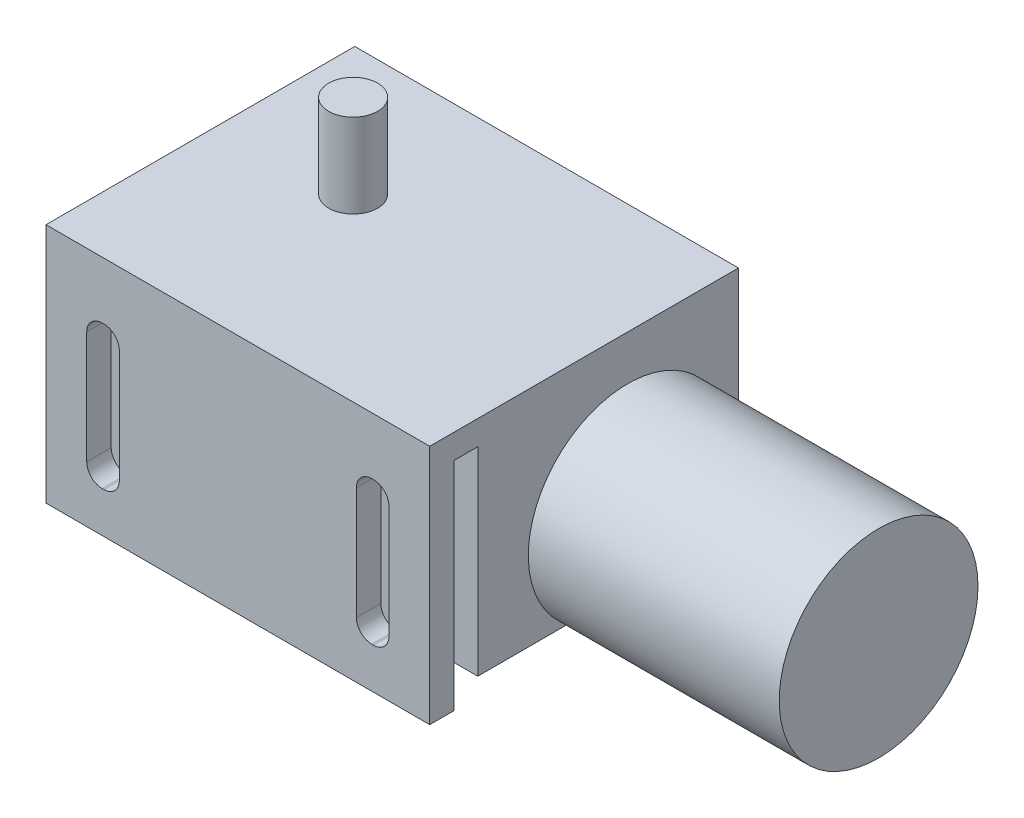
ISO-10303-21;
HEADER;
FILE_DESCRIPTION(('STEP AP214'),'2;1');
FILE_NAME('part.step','',(''),(''),'','','');
FILE_SCHEMA(('AUTOMOTIVE_DESIGN { 1 0 10303 214 1 1 1 1 }'));
ENDSEC;
DATA;
#1=APPLICATION_CONTEXT('core data for automotive mechanical design processes');
#2=APPLICATION_PROTOCOL_DEFINITION('international standard','automotive_design',2000,#1);
#3=PRODUCT_CONTEXT('',#1,'mechanical');
#4=PRODUCT('Part','Part','',(#3));
#5=PRODUCT_RELATED_PRODUCT_CATEGORY('part','',(#4));
#6=PRODUCT_DEFINITION_FORMATION('','',#4);
#7=PRODUCT_DEFINITION_CONTEXT('part definition',#1,'design');
#8=PRODUCT_DEFINITION('design','',#6,#7);
#9=PRODUCT_DEFINITION_SHAPE('','',#8);
#10=(LENGTH_UNIT() NAMED_UNIT(*) SI_UNIT(.MILLI.,.METRE.));
#11=(NAMED_UNIT(*) PLANE_ANGLE_UNIT() SI_UNIT($,.RADIAN.));
#12=(NAMED_UNIT(*) SI_UNIT($,.STERADIAN.) SOLID_ANGLE_UNIT());
#13=UNCERTAINTY_MEASURE_WITH_UNIT(LENGTH_MEASURE(1.E-05),#10,'distance_accuracy_value','');
#14=(GEOMETRIC_REPRESENTATION_CONTEXT(3) GLOBAL_UNCERTAINTY_ASSIGNED_CONTEXT((#13)) GLOBAL_UNIT_ASSIGNED_CONTEXT((#10,
#11,#12)) REPRESENTATION_CONTEXT('',''));
#15=CARTESIAN_POINT('',(0.,0.,0.));
#16=DIRECTION('',(0.,0.,1.));
#17=DIRECTION('',(1.,0.,0.));
#18=AXIS2_PLACEMENT_3D('',#15,#16,#17);
#19=CARTESIAN_POINT('',(0.,0.,37.9));
#20=DIRECTION('',(0.,0.,1.));
#21=DIRECTION('',(1.,0.,0.));
#22=AXIS2_PLACEMENT_3D('',#19,#20,#21);
#23=PLANE('',#22);
#24=DIRECTION('',(0.,1.,0.));
#25=VECTOR('',#24,1.);
#26=CARTESIAN_POINT('',(23.55,14.8,37.9));
#27=LINE('',#26,#25);
#28=CARTESIAN_POINT('',(23.55,-14.8,37.9));
#29=VERTEX_POINT('',#28);
#30=CARTESIAN_POINT('',(23.55,14.8,37.9));
#31=VERTEX_POINT('',#30);
#32=EDGE_CURVE('E378',#29,#31,#27,.T.);
#33=ORIENTED_EDGE('',*,*,#32,.T.);
#34=DIRECTION('',(-1.,0.,0.));
#35=VECTOR('',#34,1.);
#36=CARTESIAN_POINT('',(-23.55,14.8,37.9));
#37=LINE('',#36,#35);
#38=CARTESIAN_POINT('',(-23.55,14.8,37.9));
#39=VERTEX_POINT('',#38);
#40=EDGE_CURVE('E381',#31,#39,#37,.T.);
#41=ORIENTED_EDGE('',*,*,#40,.T.);
#42=DIRECTION('',(0.,-1.,0.));
#43=VECTOR('',#42,1.);
#44=CARTESIAN_POINT('',(-23.55,14.8,37.9));
#45=LINE('',#44,#43);
#46=CARTESIAN_POINT('',(-23.55,-14.8,37.9));
#47=VERTEX_POINT('',#46);
#48=EDGE_CURVE('E384',#39,#47,#45,.T.);
#49=ORIENTED_EDGE('',*,*,#48,.T.);
#50=DIRECTION('',(1.,0.,0.));
#51=VECTOR('',#50,1.);
#52=CARTESIAN_POINT('',(-23.55,-14.8,37.9));
#53=LINE('',#52,#51);
#54=EDGE_CURVE('E386',#47,#29,#53,.T.);
#55=ORIENTED_EDGE('',*,*,#54,.T.);
#56=EDGE_LOOP('',(#33,#41,#49,#55));
#57=FACE_BOUND('',#56,.T.);
#58=DIRECTION('',(0.,-1.,0.));
#59=VECTOR('',#58,1.);
#60=CARTESIAN_POINT('',(-18.55,0.,37.9));
#61=LINE('',#60,#59);
#62=CARTESIAN_POINT('',(-18.55,5.89999999999999,37.9));
#63=VERTEX_POINT('',#62);
#64=CARTESIAN_POINT('',(-18.55,-7.89999999999999,37.9));
#65=VERTEX_POINT('',#64);
#66=EDGE_CURVE('E315',#63,#65,#61,.T.);
#67=ORIENTED_EDGE('',*,*,#66,.F.);
#68=CARTESIAN_POINT('',(-16.65,5.9,37.9));
#69=DIRECTION('',(0.,0.,1.));
#70=DIRECTION('',(1.,0.,0.));
#71=AXIS2_PLACEMENT_3D('',#68,#69,#70);
#72=CIRCLE('',#71,1.9);
#73=CARTESIAN_POINT('',(-16.65,7.8,37.9));
#74=VERTEX_POINT('',#73);
#75=EDGE_CURVE('E251',#63,#74,#72,.F.);
#76=ORIENTED_EDGE('',*,*,#75,.T.);
#77=DIRECTION('',(-1.,0.,0.));
#78=VECTOR('',#77,1.);
#79=CARTESIAN_POINT('',(0.,7.8,37.9));
#80=LINE('',#79,#78);
#81=CARTESIAN_POINT('',(-16.45,7.8,37.9));
#82=VERTEX_POINT('',#81);
#83=EDGE_CURVE('E333',#82,#74,#80,.T.);
#84=ORIENTED_EDGE('',*,*,#83,.F.);
#85=CARTESIAN_POINT('',(-16.45,5.9,37.9));
#86=DIRECTION('',(0.,0.,1.));
#87=DIRECTION('',(1.,0.,0.));
#88=AXIS2_PLACEMENT_3D('',#85,#86,#87);
#89=CIRCLE('',#88,1.9);
#90=CARTESIAN_POINT('',(-14.55,5.89999999999999,37.9));
#91=VERTEX_POINT('',#90);
#92=EDGE_CURVE('E330',#82,#91,#89,.F.);
#93=ORIENTED_EDGE('',*,*,#92,.T.);
#94=DIRECTION('',(0.,-1.,0.));
#95=VECTOR('',#94,1.);
#96=CARTESIAN_POINT('',(-14.55,0.,37.9));
#97=LINE('',#96,#95);
#98=CARTESIAN_POINT('',(-14.55,-7.89999999999999,37.9));
#99=VERTEX_POINT('',#98);
#100=EDGE_CURVE('E327',#91,#99,#97,.T.);
#101=ORIENTED_EDGE('',*,*,#100,.T.);
#102=CARTESIAN_POINT('',(-16.45,-7.9,37.9));
#103=DIRECTION('',(0.,0.,1.));
#104=DIRECTION('',(1.,0.,0.));
#105=AXIS2_PLACEMENT_3D('',#102,#103,#104);
#106=CIRCLE('',#105,1.9);
#107=CARTESIAN_POINT('',(-16.45,-9.8,37.9));
#108=VERTEX_POINT('',#107);
#109=EDGE_CURVE('E324',#99,#108,#106,.F.);
#110=ORIENTED_EDGE('',*,*,#109,.T.);
#111=DIRECTION('',(-1.,0.,0.));
#112=VECTOR('',#111,1.);
#113=CARTESIAN_POINT('',(0.,-9.8,37.9));
#114=LINE('',#113,#112);
#115=CARTESIAN_POINT('',(-16.65,-9.8,37.9));
#116=VERTEX_POINT('',#115);
#117=EDGE_CURVE('E321',#108,#116,#114,.T.);
#118=ORIENTED_EDGE('',*,*,#117,.T.);
#119=CARTESIAN_POINT('',(-16.65,-7.9,37.9));
#120=DIRECTION('',(0.,0.,1.));
#121=DIRECTION('',(1.,0.,0.));
#122=AXIS2_PLACEMENT_3D('',#119,#120,#121);
#123=CIRCLE('',#122,1.9);
#124=EDGE_CURVE('E318',#116,#65,#123,.F.);
#125=ORIENTED_EDGE('',*,*,#124,.T.);
#126=EDGE_LOOP('',(#67,#76,#84,#93,#101,#110,#118,#125));
#127=FACE_BOUND('',#126,.T.);
#128=CARTESIAN_POINT('',(16.45,5.9,37.9));
#129=DIRECTION('',(0.,0.,-1.));
#130=DIRECTION('',(-1.,0.,0.));
#131=AXIS2_PLACEMENT_3D('',#128,#129,#130);
#132=CIRCLE('',#131,1.9);
#133=CARTESIAN_POINT('',(16.45,7.8,37.9));
#134=VERTEX_POINT('',#133);
#135=CARTESIAN_POINT('',(14.55,5.89999999999999,37.9));
#136=VERTEX_POINT('',#135);
#137=EDGE_CURVE('E257',#134,#136,#132,.F.);
#138=ORIENTED_EDGE('',*,*,#137,.F.);
#139=DIRECTION('',(1.,0.,0.));
#140=VECTOR('',#139,1.);
#141=CARTESIAN_POINT('',(0.,7.8,37.9));
#142=LINE('',#141,#140);
#143=CARTESIAN_POINT('',(16.65,7.8,37.9));
#144=VERTEX_POINT('',#143);
#145=EDGE_CURVE('E254',#134,#144,#142,.T.);
#146=ORIENTED_EDGE('',*,*,#145,.T.);
#147=CARTESIAN_POINT('',(16.65,5.9,37.9));
#148=DIRECTION('',(0.,0.,-1.));
#149=DIRECTION('',(-1.,0.,0.));
#150=AXIS2_PLACEMENT_3D('',#147,#148,#149);
#151=CIRCLE('',#150,1.9);
#152=CARTESIAN_POINT('',(18.55,5.9,37.9));
#153=VERTEX_POINT('',#152);
#154=EDGE_CURVE('E234',#153,#144,#151,.F.);
#155=ORIENTED_EDGE('',*,*,#154,.F.);
#156=DIRECTION('',(0.,-1.,0.));
#157=VECTOR('',#156,1.);
#158=CARTESIAN_POINT('',(18.55,0.,37.9));
#159=LINE('',#158,#157);
#160=CARTESIAN_POINT('',(18.55,-7.89999999999999,37.9));
#161=VERTEX_POINT('',#160);
#162=EDGE_CURVE('E64',#153,#161,#159,.T.);
#163=ORIENTED_EDGE('',*,*,#162,.T.);
#164=CARTESIAN_POINT('',(16.65,-7.9,37.9));
#165=DIRECTION('',(0.,0.,-1.));
#166=DIRECTION('',(-1.,0.,0.));
#167=AXIS2_PLACEMENT_3D('',#164,#165,#166);
#168=CIRCLE('',#167,1.9);
#169=CARTESIAN_POINT('',(16.65,-9.8,37.9));
#170=VERTEX_POINT('',#169);
#171=EDGE_CURVE('E269',#170,#161,#168,.F.);
#172=ORIENTED_EDGE('',*,*,#171,.F.);
#173=DIRECTION('',(1.,0.,0.));
#174=VECTOR('',#173,1.);
#175=CARTESIAN_POINT('',(0.,-9.8,37.9));
#176=LINE('',#175,#174);
#177=CARTESIAN_POINT('',(16.45,-9.8,37.9));
#178=VERTEX_POINT('',#177);
#179=EDGE_CURVE('E266',#178,#170,#176,.T.);
#180=ORIENTED_EDGE('',*,*,#179,.F.);
#181=CARTESIAN_POINT('',(16.45,-7.9,37.9));
#182=DIRECTION('',(0.,0.,-1.));
#183=DIRECTION('',(-1.,0.,0.));
#184=AXIS2_PLACEMENT_3D('',#181,#182,#183);
#185=CIRCLE('',#184,1.9);
#186=CARTESIAN_POINT('',(14.55,-7.89999999999999,37.9));
#187=VERTEX_POINT('',#186);
#188=EDGE_CURVE('E263',#187,#178,#185,.F.);
#189=ORIENTED_EDGE('',*,*,#188,.F.);
#190=DIRECTION('',(0.,-1.,0.));
#191=VECTOR('',#190,1.);
#192=CARTESIAN_POINT('',(14.55,0.,37.9));
#193=LINE('',#192,#191);
#194=EDGE_CURVE('E260',#136,#187,#193,.T.);
#195=ORIENTED_EDGE('',*,*,#194,.F.);
#196=EDGE_LOOP('',(#138,#146,#155,#163,#172,#180,#189,#195));
#197=FACE_BOUND('',#196,.T.);
#198=ADVANCED_FACE('F41',(#57,#127,#197),#23,.T.);
#199=CARTESIAN_POINT('',(-23.55,61.9891936782141,34.9));
#200=DIRECTION('',(0.,0.,1.));
#201=DIRECTION('',(1.,0.,0.));
#202=AXIS2_PLACEMENT_3D('',#199,#200,#201);
#203=PLANE('',#202);
#204=CARTESIAN_POINT('',(-16.65,5.9,34.9));
#205=DIRECTION('',(0.,0.,1.));
#206=DIRECTION('',(1.,0.,0.));
#207=AXIS2_PLACEMENT_3D('',#204,#205,#206);
#208=CIRCLE('',#207,1.9);
#209=CARTESIAN_POINT('',(-16.65,7.8,34.9));
#210=VERTEX_POINT('',#209);
#211=CARTESIAN_POINT('',(-18.55,5.89999999999999,34.9));
#212=VERTEX_POINT('',#211);
#213=EDGE_CURVE('E309',#210,#212,#208,.T.);
#214=ORIENTED_EDGE('',*,*,#213,.T.);
#215=DIRECTION('',(0.,1.,0.));
#216=VECTOR('',#215,1.);
#217=CARTESIAN_POINT('',(-18.55,0.,34.9));
#218=LINE('',#217,#216);
#219=CARTESIAN_POINT('',(-18.55,-7.89999999999998,34.9));
#220=VERTEX_POINT('',#219);
#221=EDGE_CURVE('E312',#220,#212,#218,.T.);
#222=ORIENTED_EDGE('',*,*,#221,.F.);
#223=CARTESIAN_POINT('',(-16.65,-7.9,34.9));
#224=DIRECTION('',(0.,0.,1.));
#225=DIRECTION('',(1.,0.,0.));
#226=AXIS2_PLACEMENT_3D('',#223,#224,#225);
#227=CIRCLE('',#226,1.9);
#228=CARTESIAN_POINT('',(-16.65,-9.8,34.9));
#229=VERTEX_POINT('',#228);
#230=EDGE_CURVE('E291',#220,#229,#227,.T.);
#231=ORIENTED_EDGE('',*,*,#230,.T.);
#232=DIRECTION('',(1.,0.,0.));
#233=VECTOR('',#232,1.);
#234=CARTESIAN_POINT('',(0.,-9.8,34.9));
#235=LINE('',#234,#233);
#236=CARTESIAN_POINT('',(-16.45,-9.8,34.9));
#237=VERTEX_POINT('',#236);
#238=EDGE_CURVE('E294',#229,#237,#235,.T.);
#239=ORIENTED_EDGE('',*,*,#238,.T.);
#240=CARTESIAN_POINT('',(-16.45,-7.9,34.9));
#241=DIRECTION('',(0.,0.,1.));
#242=DIRECTION('',(1.,0.,0.));
#243=AXIS2_PLACEMENT_3D('',#240,#241,#242);
#244=CIRCLE('',#243,1.9);
#245=CARTESIAN_POINT('',(-14.55,-7.9,34.9));
#246=VERTEX_POINT('',#245);
#247=EDGE_CURVE('E298',#237,#246,#244,.T.);
#248=ORIENTED_EDGE('',*,*,#247,.T.);
#249=DIRECTION('',(0.,1.,0.));
#250=VECTOR('',#249,1.);
#251=CARTESIAN_POINT('',(-14.55,0.,34.9));
#252=LINE('',#251,#250);
#253=CARTESIAN_POINT('',(-14.55,5.89999999999999,34.9));
#254=VERTEX_POINT('',#253);
#255=EDGE_CURVE('E301',#246,#254,#252,.T.);
#256=ORIENTED_EDGE('',*,*,#255,.T.);
#257=CARTESIAN_POINT('',(-16.45,5.9,34.9));
#258=DIRECTION('',(0.,0.,1.));
#259=DIRECTION('',(1.,0.,0.));
#260=AXIS2_PLACEMENT_3D('',#257,#258,#259);
#261=CIRCLE('',#260,1.9);
#262=CARTESIAN_POINT('',(-16.45,7.8,34.9));
#263=VERTEX_POINT('',#262);
#264=EDGE_CURVE('E304',#254,#263,#261,.T.);
#265=ORIENTED_EDGE('',*,*,#264,.T.);
#266=DIRECTION('',(1.,0.,0.));
#267=VECTOR('',#266,1.);
#268=CARTESIAN_POINT('',(0.,7.8,34.9));
#269=LINE('',#268,#267);
#270=EDGE_CURVE('E307',#210,#263,#269,.T.);
#271=ORIENTED_EDGE('',*,*,#270,.F.);
#272=EDGE_LOOP('',(#214,#222,#231,#239,#248,#256,#265,#271));
#273=FACE_BOUND('',#272,.T.);
#274=DIRECTION('',(1.,0.,0.));
#275=VECTOR('',#274,1.);
#276=CARTESIAN_POINT('',(-23.55,11.8,34.9));
#277=LINE('',#276,#275);
#278=CARTESIAN_POINT('',(-23.55,11.8,34.9));
#279=VERTEX_POINT('',#278);
#280=CARTESIAN_POINT('',(23.55,11.8,34.9));
#281=VERTEX_POINT('',#280);
#282=EDGE_CURVE('E356',#279,#281,#277,.T.);
#283=ORIENTED_EDGE('',*,*,#282,.T.);
#284=DIRECTION('',(0.,-1.,0.));
#285=VECTOR('',#284,1.);
#286=CARTESIAN_POINT('',(23.55,61.9891936782141,34.9));
#287=LINE('',#286,#285);
#288=CARTESIAN_POINT('',(23.55,-14.8,34.9));
#289=VERTEX_POINT('',#288);
#290=EDGE_CURVE('E367',#281,#289,#287,.T.);
#291=ORIENTED_EDGE('',*,*,#290,.T.);
#292=DIRECTION('',(-1.,0.,0.));
#293=VECTOR('',#292,1.);
#294=CARTESIAN_POINT('',(-23.55,-14.8,34.9));
#295=LINE('',#294,#293);
#296=CARTESIAN_POINT('',(-23.55,-14.8,34.9));
#297=VERTEX_POINT('',#296);
#298=EDGE_CURVE('E353',#289,#297,#295,.T.);
#299=ORIENTED_EDGE('',*,*,#298,.T.);
#300=DIRECTION('',(0.,-1.,0.));
#301=VECTOR('',#300,1.);
#302=CARTESIAN_POINT('',(-23.55,61.9891936782141,34.9));
#303=LINE('',#302,#301);
#304=EDGE_CURVE('E357',#279,#297,#303,.T.);
#305=ORIENTED_EDGE('',*,*,#304,.F.);
#306=EDGE_LOOP('',(#283,#291,#299,#305));
#307=FACE_BOUND('',#306,.T.);
#308=DIRECTION('',(-1.,0.,0.));
#309=VECTOR('',#308,1.);
#310=CARTESIAN_POINT('',(0.,7.8,34.9));
#311=LINE('',#310,#309);
#312=CARTESIAN_POINT('',(16.65,7.8,34.9));
#313=VERTEX_POINT('',#312);
#314=CARTESIAN_POINT('',(16.45,7.8,34.9));
#315=VERTEX_POINT('',#314);
#316=EDGE_CURVE('E238',#313,#315,#311,.T.);
#317=ORIENTED_EDGE('',*,*,#316,.T.);
#318=CARTESIAN_POINT('',(16.45,5.9,34.9));
#319=DIRECTION('',(0.,0.,1.));
#320=DIRECTION('',(1.,0.,0.));
#321=AXIS2_PLACEMENT_3D('',#318,#319,#320);
#322=CIRCLE('',#321,1.9);
#323=CARTESIAN_POINT('',(14.55,5.89999999999999,34.9));
#324=VERTEX_POINT('',#323);
#325=EDGE_CURVE('E235',#324,#315,#322,.F.);
#326=ORIENTED_EDGE('',*,*,#325,.F.);
#327=DIRECTION('',(0.,1.,0.));
#328=VECTOR('',#327,1.);
#329=CARTESIAN_POINT('',(14.55,0.,34.9));
#330=LINE('',#329,#328);
#331=CARTESIAN_POINT('',(14.55,-7.89999999999999,34.9));
#332=VERTEX_POINT('',#331);
#333=EDGE_CURVE('E237',#332,#324,#330,.T.);
#334=ORIENTED_EDGE('',*,*,#333,.F.);
#335=CARTESIAN_POINT('',(16.45,-7.9,34.9));
#336=DIRECTION('',(0.,0.,1.));
#337=DIRECTION('',(1.,0.,0.));
#338=AXIS2_PLACEMENT_3D('',#335,#336,#337);
#339=CIRCLE('',#338,1.9);
#340=CARTESIAN_POINT('',(16.45,-9.8,34.9));
#341=VERTEX_POINT('',#340);
#342=EDGE_CURVE('E240',#341,#332,#339,.F.);
#343=ORIENTED_EDGE('',*,*,#342,.F.);
#344=DIRECTION('',(-1.,0.,0.));
#345=VECTOR('',#344,1.);
#346=CARTESIAN_POINT('',(0.,-9.8,34.9));
#347=LINE('',#346,#345);
#348=CARTESIAN_POINT('',(16.65,-9.8,34.9));
#349=VERTEX_POINT('',#348);
#350=EDGE_CURVE('E242',#349,#341,#347,.T.);
#351=ORIENTED_EDGE('',*,*,#350,.F.);
#352=CARTESIAN_POINT('',(16.65,-7.9,34.9));
#353=DIRECTION('',(0.,0.,1.));
#354=DIRECTION('',(1.,0.,0.));
#355=AXIS2_PLACEMENT_3D('',#352,#353,#354);
#356=CIRCLE('',#355,1.9);
#357=CARTESIAN_POINT('',(18.55,-7.9,34.9));
#358=VERTEX_POINT('',#357);
#359=EDGE_CURVE('E244',#358,#349,#356,.F.);
#360=ORIENTED_EDGE('',*,*,#359,.F.);
#361=DIRECTION('',(0.,1.,0.));
#362=VECTOR('',#361,1.);
#363=CARTESIAN_POINT('',(18.55,0.,34.9));
#364=LINE('',#363,#362);
#365=CARTESIAN_POINT('',(18.55,5.89999999999999,34.9));
#366=VERTEX_POINT('',#365);
#367=EDGE_CURVE('E246',#358,#366,#364,.T.);
#368=ORIENTED_EDGE('',*,*,#367,.T.);
#369=CARTESIAN_POINT('',(16.65,5.9,34.9));
#370=DIRECTION('',(0.,0.,1.));
#371=DIRECTION('',(1.,0.,0.));
#372=AXIS2_PLACEMENT_3D('',#369,#370,#371);
#373=CIRCLE('',#372,1.9);
#374=EDGE_CURVE('E249',#313,#366,#373,.F.);
#375=ORIENTED_EDGE('',*,*,#374,.F.);
#376=EDGE_LOOP('',(#317,#326,#334,#343,#351,#360,#368,#375));
#377=FACE_BOUND('',#376,.T.);
#378=ADVANCED_FACE('F435',(#273,#307,#377),#203,.F.);
#379=CARTESIAN_POINT('',(23.55,14.8,37.9));
#380=DIRECTION('',(-1.,0.,0.));
#381=DIRECTION('',(0.,0.,1.));
#382=AXIS2_PLACEMENT_3D('',#379,#380,#381);
#383=PLANE('',#382);
#384=CARTESIAN_POINT('',(23.55,-2.9,13.6));
#385=DIRECTION('',(1.,0.,0.));
#386=DIRECTION('',(0.,0.,-1.));
#387=AXIS2_PLACEMENT_3D('',#384,#385,#386);
#388=CIRCLE('',#387,12.2);
#389=CARTESIAN_POINT('',(23.55,-12.6,6.20067570652563));
#390=VERTEX_POINT('',#389);
#391=CARTESIAN_POINT('',(23.55,-12.6,20.9993242934744));
#392=VERTEX_POINT('',#391);
#393=EDGE_CURVE('E12',#390,#392,#388,.T.);
#394=ORIENTED_EDGE('',*,*,#393,.F.);
#395=DIRECTION('',(0.,0.,1.));
#396=VECTOR('',#395,1.);
#397=CARTESIAN_POINT('',(23.55,-12.6,0.));
#398=LINE('',#397,#396);
#399=CARTESIAN_POINT('',(23.55,-12.6,0.));
#400=VERTEX_POINT('',#399);
#401=EDGE_CURVE('E215',#400,#390,#398,.T.);
#402=ORIENTED_EDGE('',*,*,#401,.F.);
#403=DIRECTION('',(0.,1.,0.));
#404=VECTOR('',#403,1.);
#405=CARTESIAN_POINT('',(23.55,14.8,0.));
#406=LINE('',#405,#404);
#407=CARTESIAN_POINT('',(23.55,14.8,0.));
#408=VERTEX_POINT('',#407);
#409=EDGE_CURVE('E377',#400,#408,#406,.T.);
#410=ORIENTED_EDGE('',*,*,#409,.T.);
#411=DIRECTION('',(0.,0.,-1.));
#412=VECTOR('',#411,1.);
#413=CARTESIAN_POINT('',(23.55,14.8,37.9));
#414=LINE('',#413,#412);
#415=EDGE_CURVE('E401',#31,#408,#414,.T.);
#416=ORIENTED_EDGE('',*,*,#415,.F.);
#417=ORIENTED_EDGE('',*,*,#32,.F.);
#418=DIRECTION('',(0.,0.,-1.));
#419=VECTOR('',#418,1.);
#420=CARTESIAN_POINT('',(23.55,-14.8,37.9));
#421=LINE('',#420,#419);
#422=EDGE_CURVE('E388',#29,#289,#421,.T.);
#423=ORIENTED_EDGE('',*,*,#422,.T.);
#424=ORIENTED_EDGE('',*,*,#290,.F.);
#425=DIRECTION('',(0.,0.,-1.));
#426=VECTOR('',#425,1.);
#427=CARTESIAN_POINT('',(23.55,11.8,32.));
#428=LINE('',#427,#426);
#429=CARTESIAN_POINT('',(23.55,11.8,32.));
#430=VERTEX_POINT('',#429);
#431=EDGE_CURVE('E354',#281,#430,#428,.T.);
#432=ORIENTED_EDGE('',*,*,#431,.T.);
#433=DIRECTION('',(0.,-1.,0.));
#434=VECTOR('',#433,1.);
#435=CARTESIAN_POINT('',(23.55,61.9891936782141,32.));
#436=LINE('',#435,#434);
#437=CARTESIAN_POINT('',(23.55,-12.6,32.));
#438=VERTEX_POINT('',#437);
#439=EDGE_CURVE('E222',#430,#438,#436,.T.);
#440=ORIENTED_EDGE('',*,*,#439,.T.);
#441=EDGE_CURVE('E213',#392,#438,#398,.T.);
#442=ORIENTED_EDGE('',*,*,#441,.F.);
#443=EDGE_LOOP('',(#394,#402,#410,#416,#417,#423,#424,#432,#440,#442));
#444=FACE_BOUND('',#443,.T.);
#445=ADVANCED_FACE('F43',(#444),#383,.F.);
#446=CARTESIAN_POINT('',(-23.55,14.8,37.9));
#447=DIRECTION('',(0.,-1.,0.));
#448=DIRECTION('',(0.,0.,-1.));
#449=AXIS2_PLACEMENT_3D('',#446,#447,#448);
#450=PLANE('',#449);
#451=CARTESIAN_POINT('',(-7.95,14.8,15.8));
#452=DIRECTION('',(0.,-1.,0.));
#453=DIRECTION('',(0.,0.,-1.));
#454=AXIS2_PLACEMENT_3D('',#451,#452,#453);
#455=CIRCLE('',#454,3.);
#456=CARTESIAN_POINT('',(-7.95,14.8,12.8));
#457=VERTEX_POINT('',#456);
#458=EDGE_CURVE('E45',#457,#457,#455,.F.);
#459=ORIENTED_EDGE('',*,*,#458,.F.);
#460=EDGE_LOOP('',(#459));
#461=FACE_BOUND('',#460,.T.);
#462=DIRECTION('',(-1.,0.,0.));
#463=VECTOR('',#462,1.);
#464=CARTESIAN_POINT('',(-23.55,14.8,0.));
#465=LINE('',#464,#463);
#466=CARTESIAN_POINT('',(-23.55,14.8,0.));
#467=VERTEX_POINT('',#466);
#468=EDGE_CURVE('E390',#408,#467,#465,.T.);
#469=ORIENTED_EDGE('',*,*,#468,.T.);
#470=DIRECTION('',(0.,0.,-1.));
#471=VECTOR('',#470,1.);
#472=CARTESIAN_POINT('',(-23.55,14.8,37.9));
#473=LINE('',#472,#471);
#474=EDGE_CURVE('E399',#39,#467,#473,.T.);
#475=ORIENTED_EDGE('',*,*,#474,.F.);
#476=ORIENTED_EDGE('',*,*,#40,.F.);
#477=ORIENTED_EDGE('',*,*,#415,.T.);
#478=EDGE_LOOP('',(#469,#475,#476,#477));
#479=FACE_BOUND('',#478,.T.);
#480=ADVANCED_FACE('F410',(#461,#479),#450,.F.);
#481=CARTESIAN_POINT('',(-23.55,14.8,37.9));
#482=DIRECTION('',(1.,0.,0.));
#483=DIRECTION('',(0.,0.,-1.));
#484=AXIS2_PLACEMENT_3D('',#481,#482,#483);
#485=PLANE('',#484);
#486=DIRECTION('',(0.,0.,1.));
#487=VECTOR('',#486,1.);
#488=CARTESIAN_POINT('',(-23.55,11.8,32.));
#489=LINE('',#488,#487);
#490=CARTESIAN_POINT('',(-23.55,11.8,32.));
#491=VERTEX_POINT('',#490);
#492=EDGE_CURVE('E359',#491,#279,#489,.T.);
#493=ORIENTED_EDGE('',*,*,#492,.T.);
#494=ORIENTED_EDGE('',*,*,#304,.T.);
#495=DIRECTION('',(0.,0.,-1.));
#496=VECTOR('',#495,1.);
#497=CARTESIAN_POINT('',(-23.55,-14.8,37.9));
#498=LINE('',#497,#496);
#499=EDGE_CURVE('E396',#47,#297,#498,.T.);
#500=ORIENTED_EDGE('',*,*,#499,.F.);
#501=ORIENTED_EDGE('',*,*,#48,.F.);
#502=ORIENTED_EDGE('',*,*,#474,.T.);
#503=DIRECTION('',(0.,-1.,0.));
#504=VECTOR('',#503,1.);
#505=CARTESIAN_POINT('',(-23.55,14.8,0.));
#506=LINE('',#505,#504);
#507=CARTESIAN_POINT('',(-23.55,-12.6,0.));
#508=VERTEX_POINT('',#507);
#509=EDGE_CURVE('E382',#467,#508,#506,.T.);
#510=ORIENTED_EDGE('',*,*,#509,.T.);
#511=DIRECTION('',(0.,0.,-1.));
#512=VECTOR('',#511,1.);
#513=CARTESIAN_POINT('',(-23.55,-12.6,0.));
#514=LINE('',#513,#512);
#515=CARTESIAN_POINT('',(-23.55,-12.6,32.));
#516=VERTEX_POINT('',#515);
#517=EDGE_CURVE('E372',#516,#508,#514,.T.);
#518=ORIENTED_EDGE('',*,*,#517,.F.);
#519=DIRECTION('',(0.,-1.,0.));
#520=VECTOR('',#519,1.);
#521=CARTESIAN_POINT('',(-23.55,61.9891936782141,32.));
#522=LINE('',#521,#520);
#523=EDGE_CURVE('E364',#491,#516,#522,.T.);
#524=ORIENTED_EDGE('',*,*,#523,.F.);
#525=EDGE_LOOP('',(#493,#494,#500,#501,#502,#510,#518,#524));
#526=FACE_BOUND('',#525,.T.);
#527=ADVANCED_FACE('F412',(#526),#485,.F.);
#528=CARTESIAN_POINT('',(-23.55,-14.8,37.9));
#529=DIRECTION('',(0.,1.,0.));
#530=DIRECTION('',(0.,0.,1.));
#531=AXIS2_PLACEMENT_3D('',#528,#529,#530);
#532=PLANE('',#531);
#533=ORIENTED_EDGE('',*,*,#499,.T.);
#534=ORIENTED_EDGE('',*,*,#298,.F.);
#535=ORIENTED_EDGE('',*,*,#422,.F.);
#536=ORIENTED_EDGE('',*,*,#54,.F.);
#537=EDGE_LOOP('',(#533,#534,#535,#536));
#538=FACE_BOUND('',#537,.T.);
#539=ADVANCED_FACE('F432',(#538),#532,.F.);
#540=CARTESIAN_POINT('',(0.,0.,0.));
#541=DIRECTION('',(0.,0.,1.));
#542=DIRECTION('',(1.,0.,0.));
#543=AXIS2_PLACEMENT_3D('',#540,#541,#542);
#544=PLANE('',#543);
#545=ORIENTED_EDGE('',*,*,#409,.F.);
#546=DIRECTION('',(1.,0.,0.));
#547=VECTOR('',#546,1.);
#548=CARTESIAN_POINT('',(-23.55,-12.6,0.));
#549=LINE('',#548,#547);
#550=EDGE_CURVE('E223',#508,#400,#549,.T.);
#551=ORIENTED_EDGE('',*,*,#550,.F.);
#552=ORIENTED_EDGE('',*,*,#509,.F.);
#553=ORIENTED_EDGE('',*,*,#468,.F.);
#554=EDGE_LOOP('',(#545,#551,#552,#553));
#555=FACE_BOUND('',#554,.T.);
#556=ADVANCED_FACE('F423',(#555),#544,.F.);
#557=CARTESIAN_POINT('',(0.,-12.6,0.));
#558=DIRECTION('',(0.,1.,0.));
#559=DIRECTION('',(0.,0.,1.));
#560=AXIS2_PLACEMENT_3D('',#557,#558,#559);
#561=PLANE('',#560);
#562=ORIENTED_EDGE('',*,*,#517,.T.);
#563=ORIENTED_EDGE('',*,*,#550,.T.);
#564=ORIENTED_EDGE('',*,*,#401,.T.);
#565=EDGE_CURVE('E210',#390,#392,#398,.T.);
#566=ORIENTED_EDGE('',*,*,#565,.T.);
#567=ORIENTED_EDGE('',*,*,#441,.T.);
#568=DIRECTION('',(-1.,0.,0.));
#569=VECTOR('',#568,1.);
#570=CARTESIAN_POINT('',(-23.55,-12.6,32.));
#571=LINE('',#570,#569);
#572=EDGE_CURVE('E375',#438,#516,#571,.T.);
#573=ORIENTED_EDGE('',*,*,#572,.T.);
#574=EDGE_LOOP('',(#562,#563,#564,#566,#567,#573));
#575=FACE_BOUND('',#574,.T.);
#576=ADVANCED_FACE('F211',(#575),#561,.F.);
#577=CARTESIAN_POINT('',(-23.55,61.9891936782141,32.));
#578=DIRECTION('',(0.,0.,-1.));
#579=DIRECTION('',(-1.,0.,0.));
#580=AXIS2_PLACEMENT_3D('',#577,#578,#579);
#581=PLANE('',#580);
#582=ORIENTED_EDGE('',*,*,#439,.F.);
#583=DIRECTION('',(-1.,0.,0.));
#584=VECTOR('',#583,1.);
#585=CARTESIAN_POINT('',(-23.55,11.8,32.));
#586=LINE('',#585,#584);
#587=EDGE_CURVE('E362',#430,#491,#586,.T.);
#588=ORIENTED_EDGE('',*,*,#587,.T.);
#589=ORIENTED_EDGE('',*,*,#523,.T.);
#590=ORIENTED_EDGE('',*,*,#572,.F.);
#591=EDGE_LOOP('',(#582,#588,#589,#590));
#592=FACE_BOUND('',#591,.T.);
#593=ADVANCED_FACE('F444',(#592),#581,.F.);
#594=CARTESIAN_POINT('',(-23.55,11.8,37.9));
#595=DIRECTION('',(0.,-1.,0.));
#596=DIRECTION('',(0.,0.,-1.));
#597=AXIS2_PLACEMENT_3D('',#594,#595,#596);
#598=PLANE('',#597);
#599=ORIENTED_EDGE('',*,*,#492,.F.);
#600=ORIENTED_EDGE('',*,*,#587,.F.);
#601=ORIENTED_EDGE('',*,*,#431,.F.);
#602=ORIENTED_EDGE('',*,*,#282,.F.);
#603=EDGE_LOOP('',(#599,#600,#601,#602));
#604=FACE_BOUND('',#603,.T.);
#605=ADVANCED_FACE('F441',(#604),#598,.T.);
#606=CARTESIAN_POINT('',(-16.65,5.9,16.8511773237144));
#607=DIRECTION('',(0.,0.,1.));
#608=DIRECTION('',(1.,0.,0.));
#609=AXIS2_PLACEMENT_3D('',#606,#607,#608);
#610=CYLINDRICAL_SURFACE('',#609,1.9);
#611=DIRECTION('',(0.,0.,1.));
#612=VECTOR('',#611,1.);
#613=CARTESIAN_POINT('',(-16.65,7.8,16.8511773237144));
#614=LINE('',#613,#612);
#615=EDGE_CURVE('E295',#210,#74,#614,.T.);
#616=ORIENTED_EDGE('',*,*,#615,.T.);
#617=ORIENTED_EDGE('',*,*,#75,.F.);
#618=DIRECTION('',(0.,0.,1.));
#619=VECTOR('',#618,1.);
#620=CARTESIAN_POINT('',(-18.55,5.89999999999999,16.8511773237144));
#621=LINE('',#620,#619);
#622=EDGE_CURVE('E336',#212,#63,#621,.T.);
#623=ORIENTED_EDGE('',*,*,#622,.F.);
#624=ORIENTED_EDGE('',*,*,#213,.F.);
#625=EDGE_LOOP('',(#616,#617,#623,#624));
#626=FACE_BOUND('',#625,.T.);
#627=ADVANCED_FACE('F451',(#626),#610,.F.);
#628=CARTESIAN_POINT('',(0.,7.8,16.8511773237144));
#629=DIRECTION('',(0.,1.,0.));
#630=DIRECTION('',(0.,0.,1.));
#631=AXIS2_PLACEMENT_3D('',#628,#629,#630);
#632=PLANE('',#631);
#633=ORIENTED_EDGE('',*,*,#270,.T.);
#634=DIRECTION('',(0.,0.,1.));
#635=VECTOR('',#634,1.);
#636=CARTESIAN_POINT('',(-16.45,7.8,16.8511773237144));
#637=LINE('',#636,#635);
#638=EDGE_CURVE('E338',#263,#82,#637,.T.);
#639=ORIENTED_EDGE('',*,*,#638,.T.);
#640=ORIENTED_EDGE('',*,*,#83,.T.);
#641=ORIENTED_EDGE('',*,*,#615,.F.);
#642=EDGE_LOOP('',(#633,#639,#640,#641));
#643=FACE_BOUND('',#642,.T.);
#644=ADVANCED_FACE('F497',(#643),#632,.F.);
#645=CARTESIAN_POINT('',(-16.45,5.9,16.8511773237144));
#646=DIRECTION('',(0.,0.,1.));
#647=DIRECTION('',(1.,0.,0.));
#648=AXIS2_PLACEMENT_3D('',#645,#646,#647);
#649=CYLINDRICAL_SURFACE('',#648,1.9);
#650=DIRECTION('',(0.,0.,1.));
#651=VECTOR('',#650,1.);
#652=CARTESIAN_POINT('',(-14.55,5.89999999999999,16.8511773237144));
#653=LINE('',#652,#651);
#654=EDGE_CURVE('E340',#254,#91,#653,.T.);
#655=ORIENTED_EDGE('',*,*,#654,.T.);
#656=ORIENTED_EDGE('',*,*,#92,.F.);
#657=ORIENTED_EDGE('',*,*,#638,.F.);
#658=ORIENTED_EDGE('',*,*,#264,.F.);
#659=EDGE_LOOP('',(#655,#656,#657,#658));
#660=FACE_BOUND('',#659,.T.);
#661=ADVANCED_FACE('F507',(#660),#649,.F.);
#662=CARTESIAN_POINT('',(-14.55,0.,16.8511773237144));
#663=DIRECTION('',(-1.,0.,0.));
#664=DIRECTION('',(0.,0.,1.));
#665=AXIS2_PLACEMENT_3D('',#662,#663,#664);
#666=PLANE('',#665);
#667=DIRECTION('',(0.,0.,1.));
#668=VECTOR('',#667,1.);
#669=CARTESIAN_POINT('',(-14.55,-7.89999999999999,16.8511773237144));
#670=LINE('',#669,#668);
#671=EDGE_CURVE('E342',#246,#99,#670,.T.);
#672=ORIENTED_EDGE('',*,*,#671,.T.);
#673=ORIENTED_EDGE('',*,*,#100,.F.);
#674=ORIENTED_EDGE('',*,*,#654,.F.);
#675=ORIENTED_EDGE('',*,*,#255,.F.);
#676=EDGE_LOOP('',(#672,#673,#674,#675));
#677=FACE_BOUND('',#676,.T.);
#678=ADVANCED_FACE('F517',(#677),#666,.T.);
#679=CARTESIAN_POINT('',(-16.45,-7.9,16.8511773237144));
#680=DIRECTION('',(0.,0.,1.));
#681=DIRECTION('',(1.,0.,0.));
#682=AXIS2_PLACEMENT_3D('',#679,#680,#681);
#683=CYLINDRICAL_SURFACE('',#682,1.9);
#684=DIRECTION('',(0.,0.,1.));
#685=VECTOR('',#684,1.);
#686=CARTESIAN_POINT('',(-16.45,-9.8,16.8511773237144));
#687=LINE('',#686,#685);
#688=EDGE_CURVE('E344',#237,#108,#687,.T.);
#689=ORIENTED_EDGE('',*,*,#688,.T.);
#690=ORIENTED_EDGE('',*,*,#109,.F.);
#691=ORIENTED_EDGE('',*,*,#671,.F.);
#692=ORIENTED_EDGE('',*,*,#247,.F.);
#693=EDGE_LOOP('',(#689,#690,#691,#692));
#694=FACE_BOUND('',#693,.T.);
#695=ADVANCED_FACE('F527',(#694),#683,.F.);
#696=CARTESIAN_POINT('',(0.,-9.8,16.8511773237144));
#697=DIRECTION('',(0.,1.,0.));
#698=DIRECTION('',(0.,0.,1.));
#699=AXIS2_PLACEMENT_3D('',#696,#697,#698);
#700=PLANE('',#699);
#701=DIRECTION('',(0.,0.,1.));
#702=VECTOR('',#701,1.);
#703=CARTESIAN_POINT('',(-16.65,-9.8,16.8511773237144));
#704=LINE('',#703,#702);
#705=EDGE_CURVE('E346',#229,#116,#704,.T.);
#706=ORIENTED_EDGE('',*,*,#705,.T.);
#707=ORIENTED_EDGE('',*,*,#117,.F.);
#708=ORIENTED_EDGE('',*,*,#688,.F.);
#709=ORIENTED_EDGE('',*,*,#238,.F.);
#710=EDGE_LOOP('',(#706,#707,#708,#709));
#711=FACE_BOUND('',#710,.T.);
#712=ADVANCED_FACE('F537',(#711),#700,.T.);
#713=CARTESIAN_POINT('',(-16.65,-7.9,16.8511773237144));
#714=DIRECTION('',(0.,0.,1.));
#715=DIRECTION('',(1.,0.,0.));
#716=AXIS2_PLACEMENT_3D('',#713,#714,#715);
#717=CYLINDRICAL_SURFACE('',#716,1.9);
#718=DIRECTION('',(0.,0.,1.));
#719=VECTOR('',#718,1.);
#720=CARTESIAN_POINT('',(-18.55,-7.89999999999999,16.8511773237144));
#721=LINE('',#720,#719);
#722=EDGE_CURVE('E348',#220,#65,#721,.T.);
#723=ORIENTED_EDGE('',*,*,#722,.T.);
#724=ORIENTED_EDGE('',*,*,#124,.F.);
#725=ORIENTED_EDGE('',*,*,#705,.F.);
#726=ORIENTED_EDGE('',*,*,#230,.F.);
#727=EDGE_LOOP('',(#723,#724,#725,#726));
#728=FACE_BOUND('',#727,.T.);
#729=ADVANCED_FACE('F547',(#728),#717,.F.);
#730=CARTESIAN_POINT('',(-18.55,0.,16.8511773237144));
#731=DIRECTION('',(-1.,0.,0.));
#732=DIRECTION('',(0.,0.,1.));
#733=AXIS2_PLACEMENT_3D('',#730,#731,#732);
#734=PLANE('',#733);
#735=ORIENTED_EDGE('',*,*,#221,.T.);
#736=ORIENTED_EDGE('',*,*,#622,.T.);
#737=ORIENTED_EDGE('',*,*,#66,.T.);
#738=ORIENTED_EDGE('',*,*,#722,.F.);
#739=EDGE_LOOP('',(#735,#736,#737,#738));
#740=FACE_BOUND('',#739,.T.);
#741=ADVANCED_FACE('F556',(#740),#734,.F.);
#742=CARTESIAN_POINT('',(0.,7.8,16.8511773237144));
#743=DIRECTION('',(0.,-1.,0.));
#744=DIRECTION('',(0.,0.,-1.));
#745=AXIS2_PLACEMENT_3D('',#742,#743,#744);
#746=PLANE('',#745);
#747=DIRECTION('',(0.,0.,1.));
#748=VECTOR('',#747,1.);
#749=CARTESIAN_POINT('',(16.65,7.8,16.8511773237144));
#750=LINE('',#749,#748);
#751=EDGE_CURVE('E273',#313,#144,#750,.T.);
#752=ORIENTED_EDGE('',*,*,#751,.T.);
#753=ORIENTED_EDGE('',*,*,#145,.F.);
#754=DIRECTION('',(0.,0.,1.));
#755=VECTOR('',#754,1.);
#756=CARTESIAN_POINT('',(16.45,7.8,16.8511773237144));
#757=LINE('',#756,#755);
#758=EDGE_CURVE('E286',#315,#134,#757,.T.);
#759=ORIENTED_EDGE('',*,*,#758,.F.);
#760=ORIENTED_EDGE('',*,*,#316,.F.);
#761=EDGE_LOOP('',(#752,#753,#759,#760));
#762=FACE_BOUND('',#761,.T.);
#763=ADVANCED_FACE('F565',(#762),#746,.T.);
#764=CARTESIAN_POINT('',(16.45,5.9,16.8511773237144));
#765=DIRECTION('',(0.,0.,1.));
#766=DIRECTION('',(1.,0.,0.));
#767=AXIS2_PLACEMENT_3D('',#764,#765,#766);
#768=CYLINDRICAL_SURFACE('',#767,1.9);
#769=ORIENTED_EDGE('',*,*,#325,.T.);
#770=ORIENTED_EDGE('',*,*,#758,.T.);
#771=ORIENTED_EDGE('',*,*,#137,.T.);
#772=DIRECTION('',(0.,0.,1.));
#773=VECTOR('',#772,1.);
#774=CARTESIAN_POINT('',(14.55,5.89999999999999,16.8511773237144));
#775=LINE('',#774,#773);
#776=EDGE_CURVE('E284',#324,#136,#775,.T.);
#777=ORIENTED_EDGE('',*,*,#776,.F.);
#778=EDGE_LOOP('',(#769,#770,#771,#777));
#779=FACE_BOUND('',#778,.T.);
#780=ADVANCED_FACE('F576',(#779),#768,.F.);
#781=CARTESIAN_POINT('',(14.55,0.,16.8511773237144));
#782=DIRECTION('',(-1.,0.,0.));
#783=DIRECTION('',(0.,0.,1.));
#784=AXIS2_PLACEMENT_3D('',#781,#782,#783);
#785=PLANE('',#784);
#786=ORIENTED_EDGE('',*,*,#333,.T.);
#787=ORIENTED_EDGE('',*,*,#776,.T.);
#788=ORIENTED_EDGE('',*,*,#194,.T.);
#789=DIRECTION('',(0.,0.,1.));
#790=VECTOR('',#789,1.);
#791=CARTESIAN_POINT('',(14.55,-7.89999999999999,16.8511773237144));
#792=LINE('',#791,#790);
#793=EDGE_CURVE('E282',#332,#187,#792,.T.);
#794=ORIENTED_EDGE('',*,*,#793,.F.);
#795=EDGE_LOOP('',(#786,#787,#788,#794));
#796=FACE_BOUND('',#795,.T.);
#797=ADVANCED_FACE('F584',(#796),#785,.F.);
#798=CARTESIAN_POINT('',(16.45,-7.9,16.8511773237144));
#799=DIRECTION('',(0.,0.,1.));
#800=DIRECTION('',(1.,0.,0.));
#801=AXIS2_PLACEMENT_3D('',#798,#799,#800);
#802=CYLINDRICAL_SURFACE('',#801,1.9);
#803=ORIENTED_EDGE('',*,*,#342,.T.);
#804=ORIENTED_EDGE('',*,*,#793,.T.);
#805=ORIENTED_EDGE('',*,*,#188,.T.);
#806=DIRECTION('',(0.,0.,1.));
#807=VECTOR('',#806,1.);
#808=CARTESIAN_POINT('',(16.45,-9.8,16.8511773237144));
#809=LINE('',#808,#807);
#810=EDGE_CURVE('E280',#341,#178,#809,.T.);
#811=ORIENTED_EDGE('',*,*,#810,.F.);
#812=EDGE_LOOP('',(#803,#804,#805,#811));
#813=FACE_BOUND('',#812,.T.);
#814=ADVANCED_FACE('F592',(#813),#802,.F.);
#815=CARTESIAN_POINT('',(0.,-9.8,16.8511773237144));
#816=DIRECTION('',(0.,-1.,0.));
#817=DIRECTION('',(0.,0.,-1.));
#818=AXIS2_PLACEMENT_3D('',#815,#816,#817);
#819=PLANE('',#818);
#820=ORIENTED_EDGE('',*,*,#350,.T.);
#821=ORIENTED_EDGE('',*,*,#810,.T.);
#822=ORIENTED_EDGE('',*,*,#179,.T.);
#823=DIRECTION('',(0.,0.,1.));
#824=VECTOR('',#823,1.);
#825=CARTESIAN_POINT('',(16.65,-9.8,16.8511773237144));
#826=LINE('',#825,#824);
#827=EDGE_CURVE('E278',#349,#170,#826,.T.);
#828=ORIENTED_EDGE('',*,*,#827,.F.);
#829=EDGE_LOOP('',(#820,#821,#822,#828));
#830=FACE_BOUND('',#829,.T.);
#831=ADVANCED_FACE('F600',(#830),#819,.F.);
#832=CARTESIAN_POINT('',(16.65,-7.9,16.8511773237144));
#833=DIRECTION('',(0.,0.,1.));
#834=DIRECTION('',(1.,0.,0.));
#835=AXIS2_PLACEMENT_3D('',#832,#833,#834);
#836=CYLINDRICAL_SURFACE('',#835,1.9);
#837=ORIENTED_EDGE('',*,*,#359,.T.);
#838=ORIENTED_EDGE('',*,*,#827,.T.);
#839=ORIENTED_EDGE('',*,*,#171,.T.);
#840=DIRECTION('',(0.,0.,1.));
#841=VECTOR('',#840,1.);
#842=CARTESIAN_POINT('',(18.55,-7.89999999999999,16.8511773237144));
#843=LINE('',#842,#841);
#844=EDGE_CURVE('E276',#358,#161,#843,.T.);
#845=ORIENTED_EDGE('',*,*,#844,.F.);
#846=EDGE_LOOP('',(#837,#838,#839,#845));
#847=FACE_BOUND('',#846,.T.);
#848=ADVANCED_FACE('F608',(#847),#836,.F.);
#849=CARTESIAN_POINT('',(18.55,0.,16.8511773237144));
#850=DIRECTION('',(-1.,0.,0.));
#851=DIRECTION('',(0.,0.,1.));
#852=AXIS2_PLACEMENT_3D('',#849,#850,#851);
#853=PLANE('',#852);
#854=ORIENTED_EDGE('',*,*,#844,.T.);
#855=ORIENTED_EDGE('',*,*,#162,.F.);
#856=DIRECTION('',(0.,0.,1.));
#857=VECTOR('',#856,1.);
#858=CARTESIAN_POINT('',(18.55,5.89999999999999,16.8511773237144));
#859=LINE('',#858,#857);
#860=EDGE_CURVE('E274',#366,#153,#859,.T.);
#861=ORIENTED_EDGE('',*,*,#860,.F.);
#862=ORIENTED_EDGE('',*,*,#367,.F.);
#863=EDGE_LOOP('',(#854,#855,#861,#862));
#864=FACE_BOUND('',#863,.T.);
#865=ADVANCED_FACE('F616',(#864),#853,.T.);
#866=CARTESIAN_POINT('',(16.65,5.9,16.8511773237144));
#867=DIRECTION('',(0.,0.,1.));
#868=DIRECTION('',(1.,0.,0.));
#869=AXIS2_PLACEMENT_3D('',#866,#867,#868);
#870=CYLINDRICAL_SURFACE('',#869,1.9);
#871=ORIENTED_EDGE('',*,*,#374,.T.);
#872=ORIENTED_EDGE('',*,*,#860,.T.);
#873=ORIENTED_EDGE('',*,*,#154,.T.);
#874=ORIENTED_EDGE('',*,*,#751,.F.);
#875=EDGE_LOOP('',(#871,#872,#873,#874));
#876=FACE_BOUND('',#875,.T.);
#877=ADVANCED_FACE('F624',(#876),#870,.F.);
#878=CARTESIAN_POINT('',(-7.95,25.1,15.8));
#879=DIRECTION('',(0.,-1.,0.));
#880=DIRECTION('',(0.,0.,-1.));
#881=AXIS2_PLACEMENT_3D('',#878,#879,#880);
#882=CYLINDRICAL_SURFACE('',#881,3.);
#883=CARTESIAN_POINT('',(-7.95,25.1,15.8));
#884=DIRECTION('',(0.,1.,0.));
#885=DIRECTION('',(0.,0.,1.));
#886=AXIS2_PLACEMENT_3D('',#883,#884,#885);
#887=CIRCLE('',#886,3.);
#888=CARTESIAN_POINT('',(-7.95,25.1,12.8));
#889=VERTEX_POINT('',#888);
#890=EDGE_CURVE('E229',#889,#889,#887,.T.);
#891=CARTESIAN_POINT('',(-7.95,25.1,12.8));
#892=CARTESIAN_POINT('',(-7.95,24.9927083333333,12.8));
#893=CARTESIAN_POINT('',(-7.95,24.8854166666667,12.8));
#894=CARTESIAN_POINT('',(-7.95,24.6708333333333,12.8));
#895=CARTESIAN_POINT('',(-7.95,24.5635416666667,12.8));
#896=CARTESIAN_POINT('',(-7.95,24.3489583333333,12.8));
#897=CARTESIAN_POINT('',(-7.95,24.2416666666667,12.8));
#898=CARTESIAN_POINT('',(-7.95,24.0270833333333,12.8));
#899=CARTESIAN_POINT('',(-7.95,23.9197916666667,12.8));
#900=CARTESIAN_POINT('',(-7.95,23.7052083333333,12.8));
#901=CARTESIAN_POINT('',(-7.95,23.5979166666667,12.8));
#902=CARTESIAN_POINT('',(-7.95,23.3833333333333,12.8));
#903=CARTESIAN_POINT('',(-7.95,23.2760416666667,12.8));
#904=CARTESIAN_POINT('',(-7.95,23.0614583333333,12.8));
#905=CARTESIAN_POINT('',(-7.95,22.9541666666667,12.8));
#906=CARTESIAN_POINT('',(-7.95,22.7395833333333,12.8));
#907=CARTESIAN_POINT('',(-7.95,22.6322916666667,12.8));
#908=CARTESIAN_POINT('',(-7.95,22.4177083333333,12.8));
#909=CARTESIAN_POINT('',(-7.95,22.3104166666667,12.8));
#910=CARTESIAN_POINT('',(-7.95,22.0958333333333,12.8));
#911=CARTESIAN_POINT('',(-7.95,21.9885416666667,12.8));
#912=CARTESIAN_POINT('',(-7.95,21.7739583333333,12.8));
#913=CARTESIAN_POINT('',(-7.95,21.6666666666667,12.8));
#914=CARTESIAN_POINT('',(-7.95,21.4520833333333,12.8));
#915=CARTESIAN_POINT('',(-7.95,21.3447916666667,12.8));
#916=CARTESIAN_POINT('',(-7.95,21.1302083333333,12.8));
#917=CARTESIAN_POINT('',(-7.95,21.0229166666667,12.8));
#918=CARTESIAN_POINT('',(-7.95,20.8083333333333,12.8));
#919=CARTESIAN_POINT('',(-7.95,20.7010416666667,12.8));
#920=CARTESIAN_POINT('',(-7.95,20.4864583333333,12.8));
#921=CARTESIAN_POINT('',(-7.95,20.3791666666667,12.8));
#922=CARTESIAN_POINT('',(-7.95,20.1645833333333,12.8));
#923=CARTESIAN_POINT('',(-7.95,20.0572916666667,12.8));
#924=CARTESIAN_POINT('',(-7.95,19.8427083333333,12.8));
#925=CARTESIAN_POINT('',(-7.95,19.7354166666667,12.8));
#926=CARTESIAN_POINT('',(-7.95,19.5208333333333,12.8));
#927=CARTESIAN_POINT('',(-7.95,19.4135416666667,12.8));
#928=CARTESIAN_POINT('',(-7.95,19.1989583333333,12.8));
#929=CARTESIAN_POINT('',(-7.95,19.0916666666667,12.8));
#930=CARTESIAN_POINT('',(-7.95,18.8770833333333,12.8));
#931=CARTESIAN_POINT('',(-7.95,18.7697916666667,12.8));
#932=CARTESIAN_POINT('',(-7.95,18.5552083333333,12.8));
#933=CARTESIAN_POINT('',(-7.95,18.4479166666667,12.8));
#934=CARTESIAN_POINT('',(-7.95,18.2333333333333,12.8));
#935=CARTESIAN_POINT('',(-7.95,18.1260416666667,12.8));
#936=CARTESIAN_POINT('',(-7.95,17.9114583333333,12.8));
#937=CARTESIAN_POINT('',(-7.95,17.8041666666667,12.8));
#938=CARTESIAN_POINT('',(-7.95,17.5895833333333,12.8));
#939=CARTESIAN_POINT('',(-7.95,17.4822916666667,12.8));
#940=CARTESIAN_POINT('',(-7.95,17.2677083333333,12.8));
#941=CARTESIAN_POINT('',(-7.95,17.1604166666667,12.8));
#942=CARTESIAN_POINT('',(-7.95,16.9458333333333,12.8));
#943=CARTESIAN_POINT('',(-7.95,16.8385416666667,12.8));
#944=CARTESIAN_POINT('',(-7.95,16.6239583333333,12.8));
#945=CARTESIAN_POINT('',(-7.95,16.5166666666667,12.8));
#946=CARTESIAN_POINT('',(-7.95,16.3020833333333,12.8));
#947=CARTESIAN_POINT('',(-7.95,16.1947916666667,12.8));
#948=CARTESIAN_POINT('',(-7.95,15.9802083333333,12.8));
#949=CARTESIAN_POINT('',(-7.95,15.8729166666667,12.8));
#950=CARTESIAN_POINT('',(-7.95,15.6583333333333,12.8));
#951=CARTESIAN_POINT('',(-7.95,15.5510416666667,12.8));
#952=CARTESIAN_POINT('',(-7.95,15.3364583333333,12.8));
#953=CARTESIAN_POINT('',(-7.95,15.2291666666667,12.8));
#954=CARTESIAN_POINT('',(-7.95,15.0145833333333,12.8));
#955=CARTESIAN_POINT('',(-7.95,14.9072916666667,12.8));
#956=CARTESIAN_POINT('',(-7.95,14.8,12.8));
#957=B_SPLINE_CURVE_WITH_KNOTS('',3,(#891,#892,#893,#894,#895,#896,#897,#898,#899,#900,#901,
#902,#903,#904,#905,#906,#907,#908,#909,#910,#911,#912,#913,#914,#915,#916,#917,#918,#919,#920,
#921,#922,#923,#924,#925,#926,#927,#928,#929,#930,#931,#932,#933,#934,#935,#936,#937,#938,#939,
#940,#941,#942,#943,#944,#945,#946,#947,#948,#949,#950,#951,#952,#953,#954,#955,#956),
.UNSPECIFIED.,.F.,.F.,(4,2,2,2,2,2,2,2,2,2,2,2,2,2,2,2,2,2,2,2,2,2,2,2,2,2,2,2,2,2,2,2,4),(0.,
0.321875000000003,0.643750000000002,0.965625000000001,1.2875,1.609375,1.93125,2.253125,2.575,
2.896875,3.21875,3.540625,3.8625,4.184375,4.50625,4.828125,5.15,5.471875,5.79375,6.115625,
6.4375,6.759375,7.08125,7.403125,7.725,8.046875,8.36875,8.690625,9.0125,9.334375,9.65625,
9.978125,10.3),.UNSPECIFIED.);
#958=EDGE_CURVE('BSEAM408',#889,#457,#957,.T.);
#959=ORIENTED_EDGE('',*,*,#890,.F.);
#960=ORIENTED_EDGE('',*,*,#458,.T.);
#961=ORIENTED_EDGE('',*,*,#958,.T.);
#962=ORIENTED_EDGE('',*,*,#958,.F.);
#963=EDGE_LOOP('',(#959,#961,#960,#962));
#964=FACE_BOUND('',#963,.T.);
#965=ADVANCED_FACE('F408',(#964),#882,.T.);
#966=CARTESIAN_POINT('',(-7.95,25.1,15.8));
#967=DIRECTION('',(0.,1.,0.));
#968=DIRECTION('',(0.,0.,1.));
#969=AXIS2_PLACEMENT_3D('',#966,#967,#968);
#970=PLANE('',#969);
#971=ORIENTED_EDGE('',*,*,#890,.T.);
#972=EDGE_LOOP('',(#971));
#973=FACE_BOUND('',#972,.T.);
#974=ADVANCED_FACE('F638',(#973),#970,.T.);
#975=CARTESIAN_POINT('',(54.35,-2.9,13.6));
#976=DIRECTION('',(-1.,0.,0.));
#977=DIRECTION('',(0.,0.,1.));
#978=AXIS2_PLACEMENT_3D('',#975,#976,#977);
#979=CYLINDRICAL_SURFACE('',#978,12.2);
#980=CARTESIAN_POINT('',(54.35,-2.9,13.6));
#981=DIRECTION('',(1.,0.,0.));
#982=DIRECTION('',(0.,0.,-1.));
#983=AXIS2_PLACEMENT_3D('',#980,#981,#982);
#984=CIRCLE('',#983,12.2);
#985=CARTESIAN_POINT('',(54.35,-2.9,1.4));
#986=VERTEX_POINT('',#985);
#987=EDGE_CURVE('E227',#986,#986,#984,.T.);
#988=ORIENTED_EDGE('',*,*,#987,.F.);
#989=EDGE_LOOP('',(#988));
#990=FACE_BOUND('',#989,.T.);
#991=EDGE_CURVE('E51',#392,#390,#388,.T.);
#992=ORIENTED_EDGE('',*,*,#991,.T.);
#993=ORIENTED_EDGE('',*,*,#393,.T.);
#994=EDGE_LOOP('',(#992,#993));
#995=FACE_BOUND('',#994,.T.);
#996=ADVANCED_FACE('F225',(#990,#995),#979,.T.);
#997=CARTESIAN_POINT('',(54.35,-2.9,13.6));
#998=DIRECTION('',(1.,0.,0.));
#999=DIRECTION('',(0.,0.,-1.));
#1000=AXIS2_PLACEMENT_3D('',#997,#998,#999);
#1001=PLANE('',#1000);
#1002=ORIENTED_EDGE('',*,*,#987,.T.);
#1003=EDGE_LOOP('',(#1002));
#1004=FACE_BOUND('',#1003,.T.);
#1005=ADVANCED_FACE('F654',(#1004),#1001,.T.);
#1006=CARTESIAN_POINT('',(23.55,-2.9,13.6));
#1007=DIRECTION('',(1.,0.,0.));
#1008=DIRECTION('',(0.,0.,-1.));
#1009=AXIS2_PLACEMENT_3D('',#1006,#1007,#1008);
#1010=PLANE('',#1009);
#1011=ORIENTED_EDGE('',*,*,#565,.F.);
#1012=ORIENTED_EDGE('',*,*,#991,.F.);
#1013=EDGE_LOOP('',(#1011,#1012));
#1014=FACE_BOUND('',#1013,.T.);
#1015=ADVANCED_FACE('F226',(#1014),#1010,.F.);
#1016=CLOSED_SHELL('',(#198,#378,#445,#480,#527,#539,#556,#576,#593,#605,#627,#644,#661,#678,
#695,#712,#729,#741,#763,#780,#797,#814,#831,#848,#865,#877,#965,#974,#996,#1005,#1015));
#1017=MANIFOLD_SOLID_BREP('B2',#1016);
#1018=ADVANCED_BREP_SHAPE_REPRESENTATION('',(#18,#1017),#14);
#1019=SHAPE_DEFINITION_REPRESENTATION(#9,#1018);
ENDSEC;
END-ISO-10303-21;
